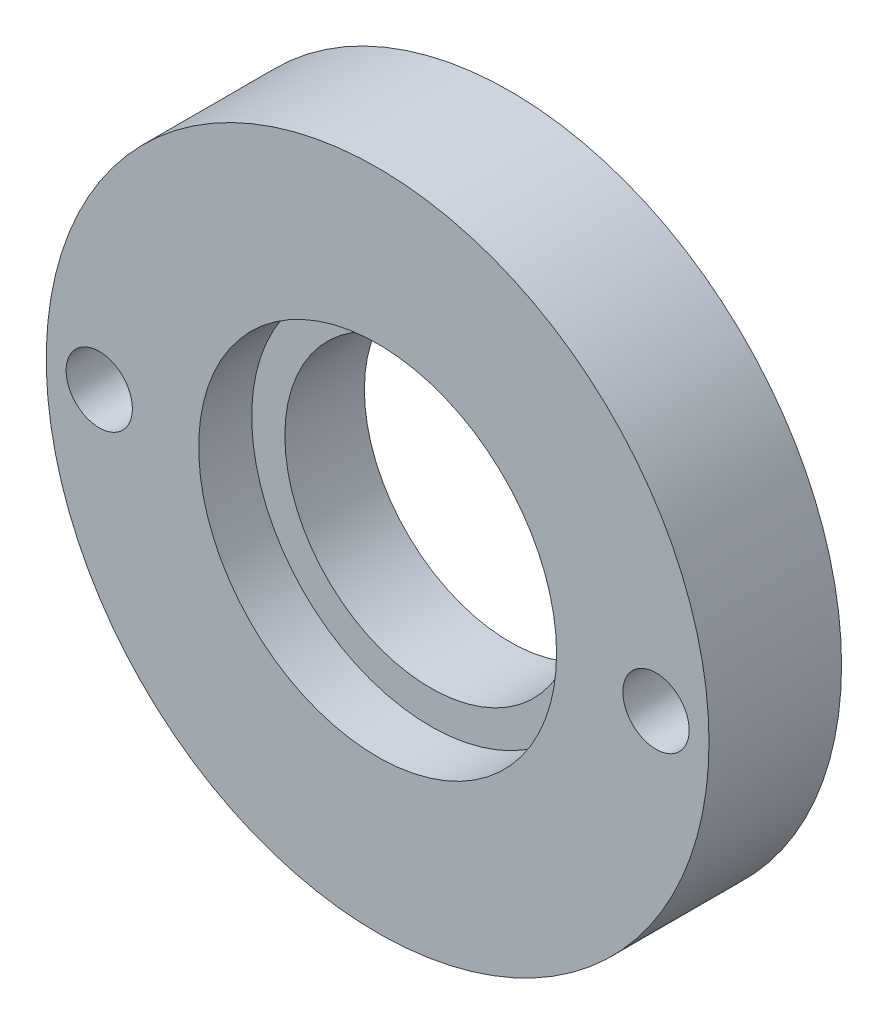
ISO-10303-21;
HEADER;
FILE_DESCRIPTION(('STEP AP214'),'2;1');
FILE_NAME('part.step','',(''),(''),'','','');
FILE_SCHEMA(('AUTOMOTIVE_DESIGN { 1 0 10303 214 1 1 1 1 }'));
ENDSEC;
DATA;
#1=APPLICATION_CONTEXT('core data for automotive mechanical design processes');
#2=APPLICATION_PROTOCOL_DEFINITION('international standard','automotive_design',2000,#1);
#3=PRODUCT_CONTEXT('',#1,'mechanical');
#4=PRODUCT('Part','Part','',(#3));
#5=PRODUCT_RELATED_PRODUCT_CATEGORY('part','',(#4));
#6=PRODUCT_DEFINITION_FORMATION('','',#4);
#7=PRODUCT_DEFINITION_CONTEXT('part definition',#1,'design');
#8=PRODUCT_DEFINITION('design','',#6,#7);
#9=PRODUCT_DEFINITION_SHAPE('','',#8);
#10=(LENGTH_UNIT() NAMED_UNIT(*) SI_UNIT(.MILLI.,.METRE.));
#11=(NAMED_UNIT(*) PLANE_ANGLE_UNIT() SI_UNIT($,.RADIAN.));
#12=(NAMED_UNIT(*) SI_UNIT($,.STERADIAN.) SOLID_ANGLE_UNIT());
#13=UNCERTAINTY_MEASURE_WITH_UNIT(LENGTH_MEASURE(1.E-05),#10,'distance_accuracy_value','');
#14=(GEOMETRIC_REPRESENTATION_CONTEXT(3) GLOBAL_UNCERTAINTY_ASSIGNED_CONTEXT((#13)) GLOBAL_UNIT_ASSIGNED_CONTEXT((#10,
#11,#12)) REPRESENTATION_CONTEXT('',''));
#15=CARTESIAN_POINT('',(0.,0.,0.));
#16=DIRECTION('',(0.,0.,1.));
#17=DIRECTION('',(1.,0.,0.));
#18=AXIS2_PLACEMENT_3D('',#15,#16,#17);
#19=CARTESIAN_POINT('',(0.,0.,10.));
#20=DIRECTION('',(0.,0.,-1.));
#21=DIRECTION('',(-1.,0.,0.));
#22=AXIS2_PLACEMENT_3D('',#19,#20,#21);
#23=CYLINDRICAL_SURFACE('',#22,25.);
#24=CARTESIAN_POINT('',(0.,0.,10.));
#25=DIRECTION('',(0.,0.,1.));
#26=DIRECTION('',(1.,0.,0.));
#27=AXIS2_PLACEMENT_3D('',#24,#25,#26);
#28=CIRCLE('',#27,25.);
#29=CARTESIAN_POINT('',(25.,0.,10.));
#30=VERTEX_POINT('',#29);
#31=EDGE_CURVE('E12',#30,#30,#28,.T.);
#32=ORIENTED_EDGE('',*,*,#31,.F.);
#33=EDGE_LOOP('',(#32));
#34=FACE_BOUND('',#33,.T.);
#35=CARTESIAN_POINT('',(0.,0.,0.));
#36=DIRECTION('',(0.,0.,1.));
#37=DIRECTION('',(1.,0.,0.));
#38=AXIS2_PLACEMENT_3D('',#35,#36,#37);
#39=CIRCLE('',#38,25.);
#40=CARTESIAN_POINT('',(25.,0.,0.));
#41=VERTEX_POINT('',#40);
#42=EDGE_CURVE('E61',#41,#41,#39,.T.);
#43=ORIENTED_EDGE('',*,*,#42,.T.);
#44=EDGE_LOOP('',(#43));
#45=FACE_BOUND('',#44,.T.);
#46=ADVANCED_FACE('F53',(#34,#45),#23,.T.);
#47=CARTESIAN_POINT('',(0.,0.,10.));
#48=DIRECTION('',(0.,0.,1.));
#49=DIRECTION('',(1.,0.,0.));
#50=AXIS2_PLACEMENT_3D('',#47,#48,#49);
#51=PLANE('',#50);
#52=CARTESIAN_POINT('',(-21.,0.,10.));
#53=DIRECTION('',(0.,0.,1.));
#54=DIRECTION('',(1.,0.,0.));
#55=AXIS2_PLACEMENT_3D('',#52,#53,#54);
#56=CIRCLE('',#55,2.49999999999999);
#57=CARTESIAN_POINT('',(-18.5,0.,10.));
#58=VERTEX_POINT('',#57);
#59=EDGE_CURVE('E92',#58,#58,#56,.T.);
#60=ORIENTED_EDGE('',*,*,#59,.F.);
#61=EDGE_LOOP('',(#60));
#62=FACE_BOUND('',#61,.T.);
#63=CARTESIAN_POINT('',(21.,0.,10.));
#64=DIRECTION('',(0.,0.,1.));
#65=DIRECTION('',(1.,0.,0.));
#66=AXIS2_PLACEMENT_3D('',#63,#64,#65);
#67=CIRCLE('',#66,2.49999999999999);
#68=CARTESIAN_POINT('',(23.5,0.,10.));
#69=VERTEX_POINT('',#68);
#70=EDGE_CURVE('E84',#69,#69,#67,.T.);
#71=ORIENTED_EDGE('',*,*,#70,.F.);
#72=EDGE_LOOP('',(#71));
#73=FACE_BOUND('',#72,.T.);
#74=CARTESIAN_POINT('',(0.,0.,10.));
#75=DIRECTION('',(0.,0.,1.));
#76=DIRECTION('',(1.,0.,0.));
#77=AXIS2_PLACEMENT_3D('',#74,#75,#76);
#78=CIRCLE('',#77,13.5);
#79=CARTESIAN_POINT('',(13.5,0.,10.));
#80=VERTEX_POINT('',#79);
#81=EDGE_CURVE('E69',#80,#80,#78,.T.);
#82=ORIENTED_EDGE('',*,*,#81,.F.);
#83=EDGE_LOOP('',(#82));
#84=FACE_BOUND('',#83,.T.);
#85=ORIENTED_EDGE('',*,*,#31,.T.);
#86=EDGE_LOOP('',(#85));
#87=FACE_BOUND('',#86,.T.);
#88=ADVANCED_FACE('F99',(#62,#73,#84,#87),#51,.T.);
#89=CARTESIAN_POINT('',(0.,0.,0.));
#90=DIRECTION('',(0.,0.,1.));
#91=DIRECTION('',(1.,0.,0.));
#92=AXIS2_PLACEMENT_3D('',#89,#90,#91);
#93=PLANE('',#92);
#94=CARTESIAN_POINT('',(-21.,0.,0.));
#95=DIRECTION('',(0.,0.,1.));
#96=DIRECTION('',(1.,0.,0.));
#97=AXIS2_PLACEMENT_3D('',#94,#95,#96);
#98=CIRCLE('',#97,2.49999999999999);
#99=CARTESIAN_POINT('',(-18.5,0.,0.));
#100=VERTEX_POINT('',#99);
#101=EDGE_CURVE('E88',#100,#100,#98,.T.);
#102=ORIENTED_EDGE('',*,*,#101,.T.);
#103=EDGE_LOOP('',(#102));
#104=FACE_BOUND('',#103,.T.);
#105=CARTESIAN_POINT('',(21.,0.,0.));
#106=DIRECTION('',(0.,0.,1.));
#107=DIRECTION('',(1.,0.,0.));
#108=AXIS2_PLACEMENT_3D('',#105,#106,#107);
#109=CIRCLE('',#108,2.49999999999999);
#110=CARTESIAN_POINT('',(23.5,0.,0.));
#111=VERTEX_POINT('',#110);
#112=EDGE_CURVE('E80',#111,#111,#109,.T.);
#113=ORIENTED_EDGE('',*,*,#112,.T.);
#114=EDGE_LOOP('',(#113));
#115=FACE_BOUND('',#114,.T.);
#116=CARTESIAN_POINT('',(0.,0.,0.));
#117=DIRECTION('',(0.,0.,-1.));
#118=DIRECTION('',(-1.,0.,0.));
#119=AXIS2_PLACEMENT_3D('',#116,#117,#118);
#120=CIRCLE('',#119,11.);
#121=CARTESIAN_POINT('',(-11.,0.,0.));
#122=VERTEX_POINT('',#121);
#123=EDGE_CURVE('E76',#122,#122,#120,.T.);
#124=ORIENTED_EDGE('',*,*,#123,.F.);
#125=EDGE_LOOP('',(#124));
#126=FACE_BOUND('',#125,.T.);
#127=ORIENTED_EDGE('',*,*,#42,.F.);
#128=EDGE_LOOP('',(#127));
#129=FACE_BOUND('',#128,.T.);
#130=ADVANCED_FACE('F102',(#104,#115,#126,#129),#93,.F.);
#131=CARTESIAN_POINT('',(0.,0.,6.));
#132=DIRECTION('',(0.,0.,1.));
#133=DIRECTION('',(1.,0.,0.));
#134=AXIS2_PLACEMENT_3D('',#131,#132,#133);
#135=CYLINDRICAL_SURFACE('',#134,13.5);
#136=CARTESIAN_POINT('',(0.,0.,6.));
#137=DIRECTION('',(0.,0.,1.));
#138=DIRECTION('',(1.,0.,0.));
#139=AXIS2_PLACEMENT_3D('',#136,#137,#138);
#140=CIRCLE('',#139,13.5);
#141=CARTESIAN_POINT('',(13.5,0.,6.));
#142=VERTEX_POINT('',#141);
#143=EDGE_CURVE('E67',#142,#142,#140,.T.);
#144=ORIENTED_EDGE('',*,*,#143,.F.);
#145=EDGE_LOOP('',(#144));
#146=FACE_BOUND('',#145,.T.);
#147=ORIENTED_EDGE('',*,*,#81,.T.);
#148=EDGE_LOOP('',(#147));
#149=FACE_BOUND('',#148,.T.);
#150=ADVANCED_FACE('F108',(#146,#149),#135,.F.);
#151=CARTESIAN_POINT('',(0.,0.,6.));
#152=DIRECTION('',(0.,0.,1.));
#153=DIRECTION('',(1.,0.,0.));
#154=AXIS2_PLACEMENT_3D('',#151,#152,#153);
#155=PLANE('',#154);
#156=CARTESIAN_POINT('',(0.,0.,6.));
#157=DIRECTION('',(0.,0.,1.));
#158=DIRECTION('',(1.,0.,0.));
#159=AXIS2_PLACEMENT_3D('',#156,#157,#158);
#160=CIRCLE('',#159,11.);
#161=CARTESIAN_POINT('',(11.,0.,6.));
#162=VERTEX_POINT('',#161);
#163=EDGE_CURVE('E56',#162,#162,#160,.T.);
#164=ORIENTED_EDGE('',*,*,#163,.F.);
#165=EDGE_LOOP('',(#164));
#166=FACE_BOUND('',#165,.T.);
#167=ORIENTED_EDGE('',*,*,#143,.T.);
#168=EDGE_LOOP('',(#167));
#169=FACE_BOUND('',#168,.T.);
#170=ADVANCED_FACE('F110',(#166,#169),#155,.T.);
#171=CARTESIAN_POINT('',(0.,0.,10.));
#172=DIRECTION('',(0.,0.,-1.));
#173=DIRECTION('',(-1.,0.,0.));
#174=AXIS2_PLACEMENT_3D('',#171,#172,#173);
#175=CYLINDRICAL_SURFACE('',#174,11.);
#176=ORIENTED_EDGE('',*,*,#163,.T.);
#177=EDGE_LOOP('',(#176));
#178=FACE_BOUND('',#177,.T.);
#179=ORIENTED_EDGE('',*,*,#123,.T.);
#180=EDGE_LOOP('',(#179));
#181=FACE_BOUND('',#180,.T.);
#182=ADVANCED_FACE('F117',(#178,#181),#175,.F.);
#183=CARTESIAN_POINT('',(21.,0.,10.));
#184=DIRECTION('',(0.,0.,1.));
#185=DIRECTION('',(1.,0.,0.));
#186=AXIS2_PLACEMENT_3D('',#183,#184,#185);
#187=CYLINDRICAL_SURFACE('',#186,2.49999999999999);
#188=ORIENTED_EDGE('',*,*,#112,.F.);
#189=EDGE_LOOP('',(#188));
#190=FACE_BOUND('',#189,.T.);
#191=ORIENTED_EDGE('',*,*,#70,.T.);
#192=EDGE_LOOP('',(#191));
#193=FACE_BOUND('',#192,.T.);
#194=ADVANCED_FACE('F148',(#190,#193),#187,.F.);
#195=CARTESIAN_POINT('',(-21.,0.,10.));
#196=DIRECTION('',(0.,0.,1.));
#197=DIRECTION('',(1.,0.,0.));
#198=AXIS2_PLACEMENT_3D('',#195,#196,#197);
#199=CYLINDRICAL_SURFACE('',#198,2.49999999999999);
#200=ORIENTED_EDGE('',*,*,#101,.F.);
#201=EDGE_LOOP('',(#200));
#202=FACE_BOUND('',#201,.T.);
#203=ORIENTED_EDGE('',*,*,#59,.T.);
#204=EDGE_LOOP('',(#203));
#205=FACE_BOUND('',#204,.T.);
#206=ADVANCED_FACE('F97',(#202,#205),#199,.F.);
#207=CLOSED_SHELL('',(#46,#88,#130,#150,#170,#182,#194,#206));
#208=MANIFOLD_SOLID_BREP('B2',#207);
#209=ADVANCED_BREP_SHAPE_REPRESENTATION('',(#18,#208),#14);
#210=SHAPE_DEFINITION_REPRESENTATION(#9,#209);
ENDSEC;
END-ISO-10303-21;
